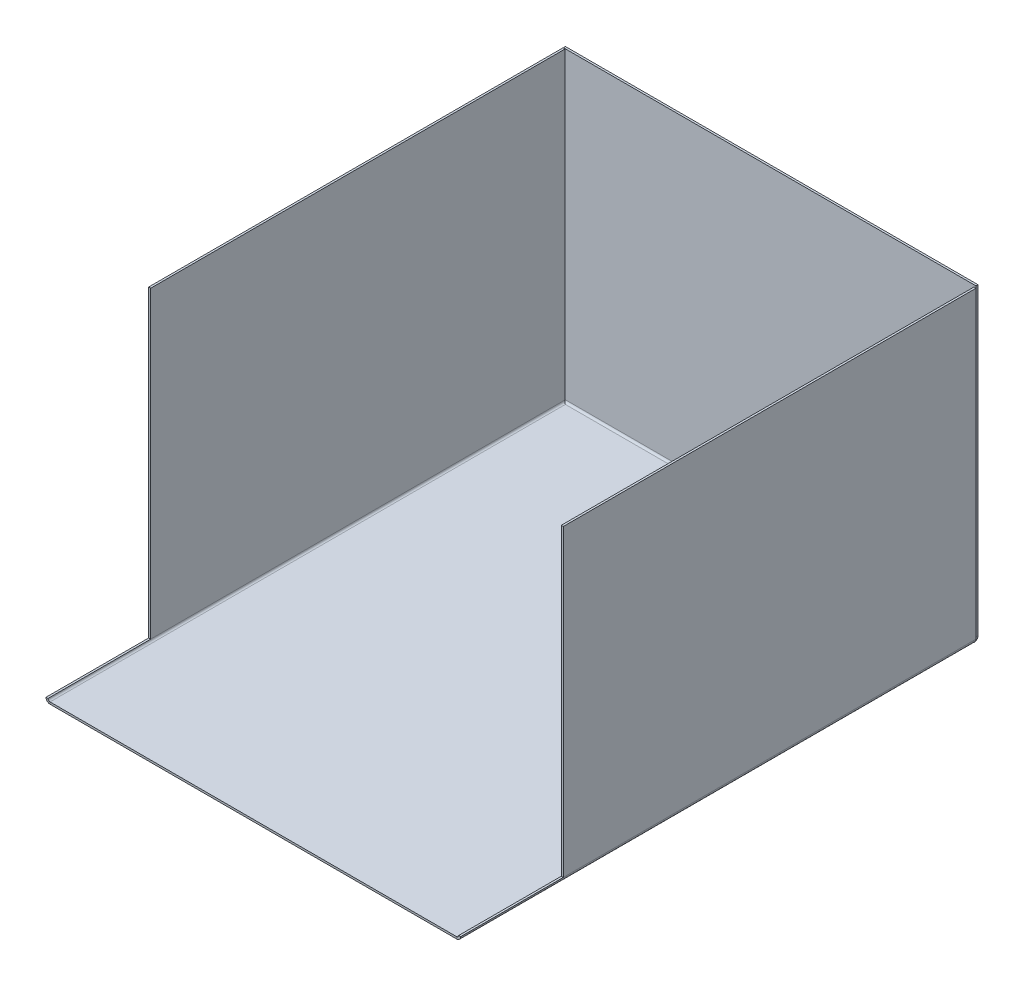
ISO-10303-21;
HEADER;
FILE_DESCRIPTION(('STEP AP214'),'2;1');
FILE_NAME('part.step','',(''),(''),'','','');
FILE_SCHEMA(('AUTOMOTIVE_DESIGN { 1 0 10303 214 1 1 1 1 }'));
ENDSEC;
DATA;
#1=APPLICATION_CONTEXT('core data for automotive mechanical design processes');
#2=APPLICATION_PROTOCOL_DEFINITION('international standard','automotive_design',2000,#1);
#3=PRODUCT_CONTEXT('',#1,'mechanical');
#4=PRODUCT('Part','Part','',(#3));
#5=PRODUCT_RELATED_PRODUCT_CATEGORY('part','',(#4));
#6=PRODUCT_DEFINITION_FORMATION('','',#4);
#7=PRODUCT_DEFINITION_CONTEXT('part definition',#1,'design');
#8=PRODUCT_DEFINITION('design','',#6,#7);
#9=PRODUCT_DEFINITION_SHAPE('','',#8);
#10=(LENGTH_UNIT() NAMED_UNIT(*) SI_UNIT(.MILLI.,.METRE.));
#11=(NAMED_UNIT(*) PLANE_ANGLE_UNIT() SI_UNIT($,.RADIAN.));
#12=(NAMED_UNIT(*) SI_UNIT($,.STERADIAN.) SOLID_ANGLE_UNIT());
#13=UNCERTAINTY_MEASURE_WITH_UNIT(LENGTH_MEASURE(1.E-05),#10,'distance_accuracy_value','');
#14=(GEOMETRIC_REPRESENTATION_CONTEXT(3) GLOBAL_UNCERTAINTY_ASSIGNED_CONTEXT((#13)) GLOBAL_UNIT_ASSIGNED_CONTEXT((#10,
#11,#12)) REPRESENTATION_CONTEXT('',''));
#15=CARTESIAN_POINT('',(0.,0.,0.));
#16=DIRECTION('',(0.,0.,1.));
#17=DIRECTION('',(1.,0.,0.));
#18=AXIS2_PLACEMENT_3D('',#15,#16,#17);
#19=CARTESIAN_POINT('',(-102.6,0.999999999999906,-0.950000000000006));
#20=DIRECTION('',(0.,1.,0.));
#21=DIRECTION('',(0.,0.,-1.));
#22=AXIS2_PLACEMENT_3D('',#19,#20,#21);
#23=PLANE('',#22);
#24=DIRECTION('',(0.,0.,-1.));
#25=VECTOR('',#24,1.);
#26=CARTESIAN_POINT('',(-101.6,0.999999999999938,255.41280087654));
#27=LINE('',#26,#25);
#28=CARTESIAN_POINT('',(-101.6,0.999999999999957,127.));
#29=VERTEX_POINT('',#28);
#30=CARTESIAN_POINT('',(-101.6,1.00000000000025,76.2));
#31=VERTEX_POINT('',#30);
#32=EDGE_CURVE('E299',#29,#31,#27,.T.);
#33=ORIENTED_EDGE('',*,*,#32,.T.);
#34=DIRECTION('',(-1.,0.,0.));
#35=VECTOR('',#34,1.);
#36=CARTESIAN_POINT('',(232.4,1.00000000000142,76.2));
#37=LINE('',#36,#35);
#38=CARTESIAN_POINT('',(-102.6,0.999999999999928,76.2));
#39=VERTEX_POINT('',#38);
#40=EDGE_CURVE('E239',#31,#39,#37,.T.);
#41=ORIENTED_EDGE('',*,*,#40,.T.);
#42=DIRECTION('',(0.,0.,-1.));
#43=VECTOR('',#42,1.);
#44=CARTESIAN_POINT('',(-102.6,0.999999999999943,127.));
#45=LINE('',#44,#43);
#46=CARTESIAN_POINT('',(-102.6,0.999999999999943,127.));
#47=VERTEX_POINT('',#46);
#48=EDGE_CURVE('E259',#47,#39,#45,.T.);
#49=ORIENTED_EDGE('',*,*,#48,.F.);
#50=DIRECTION('',(-1.,0.,0.));
#51=VECTOR('',#50,1.);
#52=CARTESIAN_POINT('',(-102.6,0.999999999999943,127.));
#53=LINE('',#52,#51);
#54=EDGE_CURVE('E254',#29,#47,#53,.T.);
#55=ORIENTED_EDGE('',*,*,#54,.F.);
#56=EDGE_LOOP('',(#33,#41,#49,#55));
#57=FACE_BOUND('',#56,.T.);
#58=ADVANCED_FACE('F78',(#57),#23,.T.);
#59=CARTESIAN_POINT('',(102.6,-3.88578058618805E-13,0.));
#60=DIRECTION('',(-1.,0.,0.));
#61=DIRECTION('',(0.,-1.,0.));
#62=AXIS2_PLACEMENT_3D('',#59,#60,#61);
#63=PLANE('',#62);
#64=DIRECTION('',(0.,1.,0.));
#65=VECTOR('',#64,1.);
#66=CARTESIAN_POINT('',(102.6,-3.88578058618805E-13,76.2));
#67=LINE('',#66,#65);
#68=CARTESIAN_POINT('',(102.6,1.00000000000067,76.2));
#69=VERTEX_POINT('',#68);
#70=CARTESIAN_POINT('',(102.600000000001,151.4,76.2));
#71=VERTEX_POINT('',#70);
#72=EDGE_CURVE('E379',#69,#71,#67,.T.);
#73=ORIENTED_EDGE('',*,*,#72,.F.);
#74=DIRECTION('',(0.,0.,1.));
#75=VECTOR('',#74,1.);
#76=CARTESIAN_POINT('',(102.6,0.999999999999973,0.));
#77=LINE('',#76,#75);
#78=CARTESIAN_POINT('',(102.6,0.999999999999973,-128.));
#79=VERTEX_POINT('',#78);
#80=EDGE_CURVE('E392',#79,#69,#77,.T.);
#81=ORIENTED_EDGE('',*,*,#80,.F.);
#82=DIRECTION('',(0.,1.,0.));
#83=VECTOR('',#82,1.);
#84=CARTESIAN_POINT('',(102.600000000001,151.4,-128.));
#85=LINE('',#84,#83);
#86=CARTESIAN_POINT('',(102.600000000001,151.4,-128.));
#87=VERTEX_POINT('',#86);
#88=EDGE_CURVE('E397',#79,#87,#85,.T.);
#89=ORIENTED_EDGE('',*,*,#88,.T.);
#90=DIRECTION('',(0.,0.,1.));
#91=VECTOR('',#90,1.);
#92=CARTESIAN_POINT('',(102.600000000001,151.4,127.));
#93=LINE('',#92,#91);
#94=EDGE_CURVE('E399',#87,#71,#93,.T.);
#95=ORIENTED_EDGE('',*,*,#94,.T.);
#96=EDGE_LOOP('',(#73,#81,#89,#95));
#97=FACE_BOUND('',#96,.T.);
#98=ADVANCED_FACE('F584',(#97),#63,.F.);
#99=CARTESIAN_POINT('',(101.6,-3.88578058618805E-13,0.));
#100=DIRECTION('',(-1.,0.,0.));
#101=DIRECTION('',(0.,-1.,0.));
#102=AXIS2_PLACEMENT_3D('',#99,#100,#101);
#103=PLANE('',#102);
#104=DIRECTION('',(0.,0.,-1.));
#105=VECTOR('',#104,1.);
#106=CARTESIAN_POINT('',(101.6,0.999999999999973,127.));
#107=LINE('',#106,#105);
#108=CARTESIAN_POINT('',(101.6,1.00000000000067,76.2));
#109=VERTEX_POINT('',#108);
#110=CARTESIAN_POINT('',(101.6,0.999999999999973,-128.));
#111=VERTEX_POINT('',#110);
#112=EDGE_CURVE('E389',#109,#111,#107,.T.);
#113=ORIENTED_EDGE('',*,*,#112,.F.);
#114=DIRECTION('',(0.,1.,0.));
#115=VECTOR('',#114,1.);
#116=CARTESIAN_POINT('',(101.6,-3.88578058618805E-13,76.2));
#117=LINE('',#116,#115);
#118=CARTESIAN_POINT('',(101.600000000001,151.400000000001,76.2));
#119=VERTEX_POINT('',#118);
#120=EDGE_CURVE('E376',#109,#119,#117,.T.);
#121=ORIENTED_EDGE('',*,*,#120,.T.);
#122=DIRECTION('',(0.,0.,1.));
#123=VECTOR('',#122,1.);
#124=CARTESIAN_POINT('',(101.600000000001,151.4,127.));
#125=LINE('',#124,#123);
#126=CARTESIAN_POINT('',(101.600000000001,151.4,-128.));
#127=VERTEX_POINT('',#126);
#128=EDGE_CURVE('E400',#127,#119,#125,.T.);
#129=ORIENTED_EDGE('',*,*,#128,.F.);
#130=DIRECTION('',(0.,1.,0.));
#131=VECTOR('',#130,1.);
#132=CARTESIAN_POINT('',(101.600000000001,151.4,-128.));
#133=LINE('',#132,#131);
#134=EDGE_CURVE('E396',#111,#127,#133,.T.);
#135=ORIENTED_EDGE('',*,*,#134,.F.);
#136=EDGE_LOOP('',(#113,#121,#129,#135));
#137=FACE_BOUND('',#136,.T.);
#138=ADVANCED_FACE('F587',(#137),#103,.T.);
#139=CARTESIAN_POINT('',(102.600000000001,151.4,127.));
#140=DIRECTION('',(0.,-1.,0.));
#141=DIRECTION('',(1.,0.,0.));
#142=AXIS2_PLACEMENT_3D('',#139,#140,#141);
#143=PLANE('',#142);
#144=DIRECTION('',(-1.,0.,0.));
#145=VECTOR('',#144,1.);
#146=CARTESIAN_POINT('',(102.600000000001,151.4,76.2));
#147=LINE('',#146,#145);
#148=EDGE_CURVE('E426',#71,#119,#147,.T.);
#149=ORIENTED_EDGE('',*,*,#148,.F.);
#150=ORIENTED_EDGE('',*,*,#94,.F.);
#151=DIRECTION('',(-1.,0.,0.));
#152=VECTOR('',#151,1.);
#153=CARTESIAN_POINT('',(102.600000000001,151.4,-128.));
#154=LINE('',#153,#152);
#155=EDGE_CURVE('E403',#87,#127,#154,.T.);
#156=ORIENTED_EDGE('',*,*,#155,.T.);
#157=ORIENTED_EDGE('',*,*,#128,.T.);
#158=EDGE_LOOP('',(#149,#150,#156,#157));
#159=FACE_BOUND('',#158,.T.);
#160=ADVANCED_FACE('F591',(#159),#143,.F.);
#161=CARTESIAN_POINT('',(0.,-1.00000000000003,0.));
#162=DIRECTION('',(0.,-1.,0.));
#163=DIRECTION('',(0.,0.,-1.));
#164=AXIS2_PLACEMENT_3D('',#161,#162,#163);
#165=PLANE('',#164);
#166=DIRECTION('',(1.,0.,0.));
#167=VECTOR('',#166,1.);
#168=CARTESIAN_POINT('',(-101.6,-1.00000000000003,-128.));
#169=LINE('',#168,#167);
#170=CARTESIAN_POINT('',(-100.6,-1.00000000000003,-128.));
#171=VERTEX_POINT('',#170);
#172=CARTESIAN_POINT('',(100.6,-0.999999999999985,-128.));
#173=VERTEX_POINT('',#172);
#174=EDGE_CURVE('E430',#171,#173,#169,.T.);
#175=ORIENTED_EDGE('',*,*,#174,.T.);
#176=DIRECTION('',(0.,0.,-1.));
#177=VECTOR('',#176,1.);
#178=CARTESIAN_POINT('',(100.6,-1.,-128.));
#179=LINE('',#178,#177);
#180=CARTESIAN_POINT('',(100.6,-1.00000000000003,127.));
#181=VERTEX_POINT('',#180);
#182=EDGE_CURVE('E414',#173,#181,#179,.F.);
#183=ORIENTED_EDGE('',*,*,#182,.T.);
#184=DIRECTION('',(1.,0.,0.));
#185=VECTOR('',#184,1.);
#186=CARTESIAN_POINT('',(-101.6,-1.00000000000003,127.));
#187=LINE('',#186,#185);
#188=CARTESIAN_POINT('',(-100.6,-1.00000000000003,127.));
#189=VERTEX_POINT('',#188);
#190=EDGE_CURVE('E423',#189,#181,#187,.T.);
#191=ORIENTED_EDGE('',*,*,#190,.F.);
#192=DIRECTION('',(0.,0.,-1.));
#193=VECTOR('',#192,1.);
#194=CARTESIAN_POINT('',(-100.6,-1.00000000000003,127.));
#195=LINE('',#194,#193);
#196=EDGE_CURVE('E467',#189,#171,#195,.T.);
#197=ORIENTED_EDGE('',*,*,#196,.T.);
#198=EDGE_LOOP('',(#175,#183,#191,#197));
#199=FACE_BOUND('',#198,.T.);
#200=ADVANCED_FACE('F595',(#199),#165,.T.);
#201=CARTESIAN_POINT('',(0.,0.,0.));
#202=DIRECTION('',(0.,-1.,0.));
#203=DIRECTION('',(0.,0.,-1.));
#204=AXIS2_PLACEMENT_3D('',#201,#202,#203);
#205=PLANE('',#204);
#206=DIRECTION('',(0.,0.,-1.));
#207=VECTOR('',#206,1.);
#208=CARTESIAN_POINT('',(100.6,0.,-128.));
#209=LINE('',#208,#207);
#210=CARTESIAN_POINT('',(100.6,0.,-128.));
#211=VERTEX_POINT('',#210);
#212=CARTESIAN_POINT('',(100.6,0.,127.));
#213=VERTEX_POINT('',#212);
#214=EDGE_CURVE('E419',#211,#213,#209,.F.);
#215=ORIENTED_EDGE('',*,*,#214,.F.);
#216=DIRECTION('',(1.,0.,0.));
#217=VECTOR('',#216,1.);
#218=CARTESIAN_POINT('',(-101.6,0.,-128.));
#219=LINE('',#218,#217);
#220=CARTESIAN_POINT('',(-100.6,0.,-128.));
#221=VERTEX_POINT('',#220);
#222=EDGE_CURVE('E102',#221,#211,#219,.T.);
#223=ORIENTED_EDGE('',*,*,#222,.F.);
#224=DIRECTION('',(0.,0.,-1.));
#225=VECTOR('',#224,1.);
#226=CARTESIAN_POINT('',(-100.6,0.,127.));
#227=LINE('',#226,#225);
#228=CARTESIAN_POINT('',(-100.6,0.,127.));
#229=VERTEX_POINT('',#228);
#230=EDGE_CURVE('E87',#229,#221,#227,.T.);
#231=ORIENTED_EDGE('',*,*,#230,.F.);
#232=DIRECTION('',(1.,0.,0.));
#233=VECTOR('',#232,1.);
#234=CARTESIAN_POINT('',(-101.6,0.,127.));
#235=LINE('',#234,#233);
#236=EDGE_CURVE('E422',#229,#213,#235,.T.);
#237=ORIENTED_EDGE('',*,*,#236,.T.);
#238=EDGE_LOOP('',(#215,#223,#231,#237));
#239=FACE_BOUND('',#238,.T.);
#240=ADVANCED_FACE('F620',(#239),#205,.F.);
#241=CARTESIAN_POINT('',(-101.6,-1.00000000000003,127.));
#242=DIRECTION('',(0.,0.,1.));
#243=DIRECTION('',(1.,0.,0.));
#244=AXIS2_PLACEMENT_3D('',#241,#242,#243);
#245=PLANE('',#244);
#246=DIRECTION('',(0.,-1.,0.));
#247=VECTOR('',#246,1.);
#248=CARTESIAN_POINT('',(100.6,0.,127.));
#249=LINE('',#248,#247);
#250=EDGE_CURVE('E413',#213,#181,#249,.T.);
#251=ORIENTED_EDGE('',*,*,#250,.F.);
#252=ORIENTED_EDGE('',*,*,#236,.F.);
#253=DIRECTION('',(0.,-1.,0.));
#254=VECTOR('',#253,1.);
#255=CARTESIAN_POINT('',(-100.6,0.,127.));
#256=LINE('',#255,#254);
#257=EDGE_CURVE('E472',#229,#189,#256,.T.);
#258=ORIENTED_EDGE('',*,*,#257,.T.);
#259=ORIENTED_EDGE('',*,*,#190,.T.);
#260=EDGE_LOOP('',(#251,#252,#258,#259));
#261=FACE_BOUND('',#260,.T.);
#262=ADVANCED_FACE('F616',(#261),#245,.T.);
#263=CARTESIAN_POINT('',(100.6,0.999999999999973,-128.));
#264=DIRECTION('',(0.,0.,1.));
#265=DIRECTION('',(1.,0.,0.));
#266=AXIS2_PLACEMENT_3D('',#263,#264,#265);
#267=PLANE('',#266);
#268=DIRECTION('',(0.,-1.,0.));
#269=VECTOR('',#268,1.);
#270=CARTESIAN_POINT('',(101.6,0.,-128.));
#271=LINE('',#270,#269);
#272=CARTESIAN_POINT('',(101.6,0.,-128.));
#273=VERTEX_POINT('',#272);
#274=CARTESIAN_POINT('',(101.6,-0.732050807568885,-128.));
#275=VERTEX_POINT('',#274);
#276=EDGE_CURVE('E457',#273,#275,#271,.T.);
#277=ORIENTED_EDGE('',*,*,#276,.F.);
#278=DIRECTION('',(-1.,0.,0.));
#279=VECTOR('',#278,1.);
#280=CARTESIAN_POINT('',(101.6,0.,-128.));
#281=LINE('',#280,#279);
#282=EDGE_CURVE('E452',#273,#211,#281,.T.);
#283=ORIENTED_EDGE('',*,*,#282,.T.);
#284=CARTESIAN_POINT('',(100.6,0.999999999999973,-128.));
#285=DIRECTION('',(0.,0.,-1.));
#286=DIRECTION('',(-1.,0.,0.));
#287=AXIS2_PLACEMENT_3D('',#284,#285,#286);
#288=CIRCLE('',#287,0.999999999999987);
#289=EDGE_CURVE('E409',#111,#211,#288,.T.);
#290=ORIENTED_EDGE('',*,*,#289,.F.);
#291=DIRECTION('',(1.,0.,0.));
#292=VECTOR('',#291,1.);
#293=CARTESIAN_POINT('',(101.6,0.999999999999973,-128.));
#294=LINE('',#293,#292);
#295=EDGE_CURVE('E388',#111,#79,#294,.T.);
#296=ORIENTED_EDGE('',*,*,#295,.T.);
#297=CARTESIAN_POINT('',(100.6,0.999999999999973,-128.));
#298=DIRECTION('',(0.,0.,-1.));
#299=DIRECTION('',(-1.,0.,0.));
#300=AXIS2_PLACEMENT_3D('',#297,#298,#299);
#301=CIRCLE('',#300,1.99999999999999);
#302=EDGE_CURVE('E418',#79,#275,#301,.T.);
#303=ORIENTED_EDGE('',*,*,#302,.T.);
#304=EDGE_LOOP('',(#277,#283,#290,#296,#303));
#305=FACE_BOUND('',#304,.T.);
#306=ADVANCED_FACE('F612',(#305),#267,.F.);
#307=CARTESIAN_POINT('',(100.6,0.999999999999973,127.));
#308=DIRECTION('',(0.,0.,1.));
#309=DIRECTION('',(1.,0.,0.));
#310=AXIS2_PLACEMENT_3D('',#307,#308,#309);
#311=PLANE('',#310);
#312=DIRECTION('',(1.,0.,0.));
#313=VECTOR('',#312,1.);
#314=CARTESIAN_POINT('',(101.6,0.999999999999973,127.));
#315=LINE('',#314,#313);
#316=CARTESIAN_POINT('',(101.6,1.00000000000067,127.));
#317=VERTEX_POINT('',#316);
#318=CARTESIAN_POINT('',(102.6,1.00000000000067,127.));
#319=VERTEX_POINT('',#318);
#320=EDGE_CURVE('E384',#317,#319,#315,.T.);
#321=ORIENTED_EDGE('',*,*,#320,.F.);
#322=CARTESIAN_POINT('',(100.6,0.999999999999973,127.));
#323=DIRECTION('',(0.,0.,-1.));
#324=DIRECTION('',(-1.,0.,0.));
#325=AXIS2_PLACEMENT_3D('',#322,#323,#324);
#326=CIRCLE('',#325,0.999999999999987);
#327=EDGE_CURVE('E415',#213,#317,#326,.F.);
#328=ORIENTED_EDGE('',*,*,#327,.F.);
#329=ORIENTED_EDGE('',*,*,#250,.T.);
#330=CARTESIAN_POINT('',(100.6,0.999999999999973,127.));
#331=DIRECTION('',(0.,0.,-1.));
#332=DIRECTION('',(-1.,0.,0.));
#333=AXIS2_PLACEMENT_3D('',#330,#331,#332);
#334=CIRCLE('',#333,1.99999999999999);
#335=EDGE_CURVE('E410',#181,#319,#334,.F.);
#336=ORIENTED_EDGE('',*,*,#335,.T.);
#337=EDGE_LOOP('',(#321,#328,#329,#336));
#338=FACE_BOUND('',#337,.T.);
#339=ADVANCED_FACE('F605',(#338),#311,.T.);
#340=CARTESIAN_POINT('',(100.6,0.999999999999973,-128.));
#341=DIRECTION('',(0.,0.,-1.));
#342=DIRECTION('',(1.,0.,0.));
#343=AXIS2_PLACEMENT_3D('',#340,#341,#342);
#344=CYLINDRICAL_SURFACE('',#343,1.99999999999999);
#345=ORIENTED_EDGE('',*,*,#182,.F.);
#346=CARTESIAN_POINT('',(100.6,0.999999999999973,-128.));
#347=DIRECTION('',(0.,0.,-1.));
#348=DIRECTION('',(-1.,0.,0.));
#349=AXIS2_PLACEMENT_3D('',#346,#347,#348);
#350=CIRCLE('',#349,1.99999999999999);
#351=EDGE_CURVE('E462',#275,#173,#350,.T.);
#352=ORIENTED_EDGE('',*,*,#351,.F.);
#353=ORIENTED_EDGE('',*,*,#302,.F.);
#354=ORIENTED_EDGE('',*,*,#80,.T.);
#355=DIRECTION('',(0.,0.,-1.));
#356=VECTOR('',#355,1.);
#357=CARTESIAN_POINT('',(102.6,1.00000000000067,0.));
#358=LINE('',#357,#356);
#359=EDGE_CURVE('E382',#319,#69,#358,.T.);
#360=ORIENTED_EDGE('',*,*,#359,.F.);
#361=ORIENTED_EDGE('',*,*,#335,.F.);
#362=EDGE_LOOP('',(#345,#352,#353,#354,#360,#361));
#363=FACE_BOUND('',#362,.T.);
#364=ADVANCED_FACE('F602',(#363),#344,.T.);
#365=CARTESIAN_POINT('',(100.6,0.999999999999973,-128.));
#366=DIRECTION('',(0.,0.,-1.));
#367=DIRECTION('',(1.,0.,0.));
#368=AXIS2_PLACEMENT_3D('',#365,#366,#367);
#369=CYLINDRICAL_SURFACE('',#368,0.999999999999987);
#370=ORIENTED_EDGE('',*,*,#214,.T.);
#371=ORIENTED_EDGE('',*,*,#327,.T.);
#372=EDGE_CURVE('E385',#317,#109,#107,.T.);
#373=ORIENTED_EDGE('',*,*,#372,.T.);
#374=ORIENTED_EDGE('',*,*,#112,.T.);
#375=ORIENTED_EDGE('',*,*,#289,.T.);
#376=EDGE_LOOP('',(#370,#371,#373,#374,#375));
#377=FACE_BOUND('',#376,.T.);
#378=ADVANCED_FACE('F600',(#377),#369,.F.);
#379=CARTESIAN_POINT('',(102.600000000001,151.4,-128.));
#380=DIRECTION('',(0.,0.,1.));
#381=DIRECTION('',(1.,0.,0.));
#382=AXIS2_PLACEMENT_3D('',#379,#380,#381);
#383=PLANE('',#382);
#384=ORIENTED_EDGE('',*,*,#295,.F.);
#385=ORIENTED_EDGE('',*,*,#134,.T.);
#386=ORIENTED_EDGE('',*,*,#155,.F.);
#387=ORIENTED_EDGE('',*,*,#88,.F.);
#388=EDGE_LOOP('',(#384,#385,#386,#387));
#389=FACE_BOUND('',#388,.T.);
#390=ADVANCED_FACE('F597',(#389),#383,.F.);
#391=CARTESIAN_POINT('',(232.4,151.400000000001,76.2));
#392=DIRECTION('',(0.,0.,1.));
#393=DIRECTION('',(0.,-1.,0.));
#394=AXIS2_PLACEMENT_3D('',#391,#392,#393);
#395=PLANE('',#394);
#396=ORIENTED_EDGE('',*,*,#72,.T.);
#397=ORIENTED_EDGE('',*,*,#148,.T.);
#398=ORIENTED_EDGE('',*,*,#120,.F.);
#399=DIRECTION('',(-1.,0.,0.));
#400=VECTOR('',#399,1.);
#401=CARTESIAN_POINT('',(232.4,1.00000000000114,76.2));
#402=LINE('',#401,#400);
#403=EDGE_CURVE('E380',#69,#109,#402,.T.);
#404=ORIENTED_EDGE('',*,*,#403,.F.);
#405=EDGE_LOOP('',(#396,#397,#398,#404));
#406=FACE_BOUND('',#405,.T.);
#407=ADVANCED_FACE('F80',(#406),#395,.T.);
#408=CARTESIAN_POINT('',(232.4,1.00000000000111,127.));
#409=DIRECTION('',(0.,1.,0.));
#410=DIRECTION('',(-1.,0.,0.));
#411=AXIS2_PLACEMENT_3D('',#408,#409,#410);
#412=PLANE('',#411);
#413=ORIENTED_EDGE('',*,*,#359,.T.);
#414=ORIENTED_EDGE('',*,*,#403,.T.);
#415=ORIENTED_EDGE('',*,*,#372,.F.);
#416=ORIENTED_EDGE('',*,*,#320,.T.);
#417=EDGE_LOOP('',(#413,#414,#415,#416));
#418=FACE_BOUND('',#417,.T.);
#419=ADVANCED_FACE('F626',(#418),#412,.T.);
#420=CARTESIAN_POINT('',(101.6,151.4,-130.000000000001));
#421=DIRECTION('',(0.,-1.,0.));
#422=DIRECTION('',(0.,0.,-1.));
#423=AXIS2_PLACEMENT_3D('',#420,#421,#422);
#424=PLANE('',#423);
#425=DIRECTION('',(-1.,0.,0.));
#426=VECTOR('',#425,1.);
#427=CARTESIAN_POINT('',(101.6,151.4,-129.000000000001));
#428=LINE('',#427,#426);
#429=CARTESIAN_POINT('',(-102.600000000001,151.4,-129.000000000001));
#430=VERTEX_POINT('',#429);
#431=CARTESIAN_POINT('',(101.6,151.4,-129.000000000001));
#432=VERTEX_POINT('',#431);
#433=EDGE_CURVE('E546',#430,#432,#428,.F.);
#434=ORIENTED_EDGE('',*,*,#433,.T.);
#435=DIRECTION('',(0.,0.,1.));
#436=VECTOR('',#435,1.);
#437=CARTESIAN_POINT('',(101.6,151.4,-130.000000000001));
#438=LINE('',#437,#436);
#439=CARTESIAN_POINT('',(101.6,151.4,-130.000000000001));
#440=VERTEX_POINT('',#439);
#441=EDGE_CURVE('E529',#440,#432,#438,.T.);
#442=ORIENTED_EDGE('',*,*,#441,.F.);
#443=DIRECTION('',(1.,0.,0.));
#444=VECTOR('',#443,1.);
#445=CARTESIAN_POINT('',(0.,151.4,-130.000000000001));
#446=LINE('',#445,#444);
#447=CARTESIAN_POINT('',(-102.600000000001,151.4,-130.000000000001));
#448=VERTEX_POINT('',#447);
#449=EDGE_CURVE('E540',#448,#440,#446,.T.);
#450=ORIENTED_EDGE('',*,*,#449,.F.);
#451=DIRECTION('',(0.,0.,1.));
#452=VECTOR('',#451,1.);
#453=CARTESIAN_POINT('',(-102.600000000001,151.4,-130.000000000001));
#454=LINE('',#453,#452);
#455=EDGE_CURVE('E543',#448,#430,#454,.T.);
#456=ORIENTED_EDGE('',*,*,#455,.T.);
#457=EDGE_LOOP('',(#434,#442,#450,#456));
#458=FACE_BOUND('',#457,.T.);
#459=ADVANCED_FACE('F505',(#458),#424,.F.);
#460=CARTESIAN_POINT('',(0.,-4.45857425595861E-13,-130.));
#461=DIRECTION('',(0.,0.,1.));
#462=DIRECTION('',(0.,-1.,0.));
#463=AXIS2_PLACEMENT_3D('',#460,#461,#462);
#464=PLANE('',#463);
#465=DIRECTION('',(1.,0.,0.));
#466=VECTOR('',#465,1.);
#467=CARTESIAN_POINT('',(101.6,1.00000000000001,-130.));
#468=LINE('',#467,#466);
#469=CARTESIAN_POINT('',(-102.6,0.999999999999987,-130.));
#470=VERTEX_POINT('',#469);
#471=CARTESIAN_POINT('',(101.6,0.999999999999987,-130.));
#472=VERTEX_POINT('',#471);
#473=EDGE_CURVE('E373',#470,#472,#468,.T.);
#474=ORIENTED_EDGE('',*,*,#473,.F.);
#475=DIRECTION('',(0.,1.,0.));
#476=VECTOR('',#475,1.);
#477=CARTESIAN_POINT('',(-102.6,0.999999999999987,-130.));
#478=LINE('',#477,#476);
#479=EDGE_CURVE('E542',#470,#448,#478,.T.);
#480=ORIENTED_EDGE('',*,*,#479,.T.);
#481=ORIENTED_EDGE('',*,*,#449,.T.);
#482=DIRECTION('',(0.,-1.,0.));
#483=VECTOR('',#482,1.);
#484=CARTESIAN_POINT('',(101.6,-4.45857425595861E-13,-130.));
#485=LINE('',#484,#483);
#486=EDGE_CURVE('E536',#440,#472,#485,.T.);
#487=ORIENTED_EDGE('',*,*,#486,.T.);
#488=EDGE_LOOP('',(#474,#480,#481,#487));
#489=FACE_BOUND('',#488,.T.);
#490=ADVANCED_FACE('F576',(#489),#464,.F.);
#491=CARTESIAN_POINT('',(-102.6,0.999999999999987,-130.));
#492=DIRECTION('',(1.,0.,0.));
#493=DIRECTION('',(0.,1.,0.));
#494=AXIS2_PLACEMENT_3D('',#491,#492,#493);
#495=PLANE('',#494);
#496=DIRECTION('',(0.,1.,0.));
#497=VECTOR('',#496,1.);
#498=CARTESIAN_POINT('',(-102.6,0.99999999999999,-129.));
#499=LINE('',#498,#497);
#500=CARTESIAN_POINT('',(-102.6,0.99999999999999,-129.));
#501=VERTEX_POINT('',#500);
#502=EDGE_CURVE('E539',#501,#430,#499,.T.);
#503=ORIENTED_EDGE('',*,*,#502,.T.);
#504=ORIENTED_EDGE('',*,*,#455,.F.);
#505=ORIENTED_EDGE('',*,*,#479,.F.);
#506=CARTESIAN_POINT('',(-102.6,1.,-128.99));
#507=CARTESIAN_POINT('',(-102.6,1.,-129.));
#508=CARTESIAN_POINT('',(-102.6,0.999999999999987,-130.));
#509=CARTESIAN_POINT('',(-102.6,0.999999999999987,-130.0101));
#510=B_SPLINE_CURVE_WITH_KNOTS('',1,(#506,#507,#508,#509),.UNSPECIFIED.,.F.,.F.,(2,1,1,2),
(-0.0101,-9.9999999999989E-05,0.9999,1.01),.UNSPECIFIED.);
#511=EDGE_CURVE('E535',#470,#501,#510,.F.);
#512=ORIENTED_EDGE('',*,*,#511,.T.);
#513=EDGE_LOOP('',(#503,#504,#505,#512));
#514=FACE_BOUND('',#513,.T.);
#515=ADVANCED_FACE('F566',(#514),#495,.F.);
#516=CARTESIAN_POINT('',(0.,-4.42365944257018E-13,-129.));
#517=DIRECTION('',(0.,0.,1.));
#518=DIRECTION('',(0.,-1.,0.));
#519=AXIS2_PLACEMENT_3D('',#516,#517,#518);
#520=PLANE('',#519);
#521=ORIENTED_EDGE('',*,*,#433,.F.);
#522=ORIENTED_EDGE('',*,*,#502,.F.);
#523=DIRECTION('',(-1.,0.,0.));
#524=VECTOR('',#523,1.);
#525=CARTESIAN_POINT('',(101.6,1.,-129.));
#526=LINE('',#525,#524);
#527=CARTESIAN_POINT('',(101.6,1.,-129.));
#528=VERTEX_POINT('',#527);
#529=EDGE_CURVE('E548',#528,#501,#526,.T.);
#530=ORIENTED_EDGE('',*,*,#529,.F.);
#531=DIRECTION('',(0.,1.,0.));
#532=VECTOR('',#531,1.);
#533=CARTESIAN_POINT('',(101.6,0.,-129.));
#534=LINE('',#533,#532);
#535=EDGE_CURVE('E447',#432,#528,#534,.F.);
#536=ORIENTED_EDGE('',*,*,#535,.F.);
#537=EDGE_LOOP('',(#521,#522,#530,#536));
#538=FACE_BOUND('',#537,.T.);
#539=ADVANCED_FACE('F575',(#538),#520,.T.);
#540=CARTESIAN_POINT('',(101.6,0.,-130.));
#541=DIRECTION('',(-1.,0.,0.));
#542=DIRECTION('',(0.,0.,1.));
#543=AXIS2_PLACEMENT_3D('',#540,#541,#542);
#544=PLANE('',#543);
#545=DIRECTION('',(0.,0.,-1.));
#546=VECTOR('',#545,1.);
#547=CARTESIAN_POINT('',(101.6,1.00000000000001,-130.));
#548=LINE('',#547,#546);
#549=EDGE_CURVE('E532',#528,#472,#548,.T.);
#550=ORIENTED_EDGE('',*,*,#549,.T.);
#551=ORIENTED_EDGE('',*,*,#486,.F.);
#552=ORIENTED_EDGE('',*,*,#441,.T.);
#553=ORIENTED_EDGE('',*,*,#535,.T.);
#554=EDGE_LOOP('',(#550,#551,#552,#553));
#555=FACE_BOUND('',#554,.T.);
#556=ADVANCED_FACE('F579',(#555),#544,.F.);
#557=CARTESIAN_POINT('',(101.6,1.00000000000001,-128.));
#558=DIRECTION('',(1.,0.,0.));
#559=DIRECTION('',(0.,0.,-1.));
#560=AXIS2_PLACEMENT_3D('',#557,#558,#559);
#561=PLANE('',#560);
#562=ORIENTED_EDGE('',*,*,#549,.F.);
#563=CARTESIAN_POINT('',(101.6,1.00000000000001,-128.));
#564=DIRECTION('',(-1.,0.,0.));
#565=DIRECTION('',(0.,0.,1.));
#566=AXIS2_PLACEMENT_3D('',#563,#564,#565);
#567=CIRCLE('',#566,1.);
#568=EDGE_CURVE('E353',#528,#273,#567,.T.);
#569=ORIENTED_EDGE('',*,*,#568,.T.);
#570=ORIENTED_EDGE('',*,*,#276,.T.);
#571=DIRECTION('',(0.,-1.,0.));
#572=VECTOR('',#571,1.);
#573=CARTESIAN_POINT('',(101.6,-0.999999999999986,-128.));
#574=LINE('',#573,#572);
#575=CARTESIAN_POINT('',(101.6,-0.999999999999986,-128.));
#576=VERTEX_POINT('',#575);
#577=EDGE_CURVE('E370',#275,#576,#574,.T.);
#578=ORIENTED_EDGE('',*,*,#577,.T.);
#579=CARTESIAN_POINT('',(101.6,1.00000000000001,-128.));
#580=DIRECTION('',(-1.,0.,0.));
#581=DIRECTION('',(0.,0.,1.));
#582=AXIS2_PLACEMENT_3D('',#579,#580,#581);
#583=CIRCLE('',#582,2.);
#584=EDGE_CURVE('E354',#472,#576,#583,.T.);
#585=ORIENTED_EDGE('',*,*,#584,.F.);
#586=EDGE_LOOP('',(#562,#569,#570,#578,#585));
#587=FACE_BOUND('',#586,.T.);
#588=ADVANCED_FACE('F504',(#587),#561,.T.);
#589=CARTESIAN_POINT('',(0.500000000000056,-0.999999999999985,-128.));
#590=DIRECTION('',(0.,0.,1.));
#591=DIRECTION('',(-1.,0.,0.));
#592=AXIS2_PLACEMENT_3D('',#589,#590,#591);
#593=PLANE('',#592);
#594=ORIENTED_EDGE('',*,*,#577,.F.);
#595=ORIENTED_EDGE('',*,*,#351,.T.);
#596=DIRECTION('',(-1.,0.,0.));
#597=VECTOR('',#596,1.);
#598=CARTESIAN_POINT('',(-100.6,-0.999999999999985,-128.));
#599=LINE('',#598,#597);
#600=EDGE_CURVE('E357',#576,#173,#599,.T.);
#601=ORIENTED_EDGE('',*,*,#600,.F.);
#602=EDGE_LOOP('',(#594,#595,#601));
#603=FACE_BOUND('',#602,.T.);
#604=ADVANCED_FACE('F502',(#603),#593,.T.);
#605=CARTESIAN_POINT('',(-100.6,-1.01009999999998,-128.));
#606=CARTESIAN_POINT('',(-100.766688150092,-1.01009999999999,-128.263155311734));
#607=CARTESIAN_POINT('',(-100.933333333333,-0.95778247737098,-128.526139422351));
#608=CARTESIAN_POINT('',(-101.266666666666,-0.756398019230903,-129.012324512444));
#609=CARTESIAN_POINT('',(-101.433333333333,-0.607410319904594,-129.235300361822));
#610=CARTESIAN_POINT('',(-101.766666666666,-0.235300361821593,-129.607410319905));
#611=CARTESIAN_POINT('',(-101.933333333333,-0.0123245124435623,-129.756398019231));
#612=CARTESIAN_POINT('',(-102.266666666666,0.473860577649394,-129.957782477371));
#613=CARTESIAN_POINT('',(-102.433311849908,0.736844688266329,-130.0101));
#614=CARTESIAN_POINT('',(-102.6,0.999999999999987,-130.0101));
#615=CARTESIAN_POINT('',(-100.6,-0.999999999999985,-128.));
#616=CARTESIAN_POINT('',(-100.76668804991,-0.999999999999992,-128.26183297652));
#617=CARTESIAN_POINT('',(-100.933333333333,-0.94794535333663,-128.523495768719));
#618=CARTESIAN_POINT('',(-101.266666666666,-0.747572776708525,-129.007237960742));
#619=CARTESIAN_POINT('',(-101.433333333333,-0.599333684796372,-129.22909343995));
#620=CARTESIAN_POINT('',(-101.766666666666,-0.229093439949846,-129.599333684796));
#621=CARTESIAN_POINT('',(-101.933333333333,-0.00723796074181604,-129.747572776708));
#622=CARTESIAN_POINT('',(-102.266666666666,0.476504231281423,-129.947945353337));
#623=CARTESIAN_POINT('',(-102.433311950089,0.738167023479919,-130.));
#624=CARTESIAN_POINT('',(-102.6,0.999999999999987,-130.));
#625=CARTESIAN_POINT('',(-100.6,0.,-128.));
#626=CARTESIAN_POINT('',(-100.766678130975,0.,-128.130908697947));
#627=CARTESIAN_POINT('',(-100.933333333333,0.026027323331692,-128.261747884359));
#628=CARTESIAN_POINT('',(-101.266666666666,0.126213611645744,-128.503618980371));
#629=CARTESIAN_POINT('',(-101.433333333333,0.200333157601822,-128.614546719975));
#630=CARTESIAN_POINT('',(-101.766666666666,0.385453280025086,-128.799666842398));
#631=CARTESIAN_POINT('',(-101.933333333333,0.496381019629102,-128.873786388354));
#632=CARTESIAN_POINT('',(-102.266666666666,0.738252115640721,-128.973972676668));
#633=CARTESIAN_POINT('',(-102.433321869024,0.869091302053264,-129.));
#634=CARTESIAN_POINT('',(-102.6,1.,-129.));
#635=CARTESIAN_POINT('',(-100.6,0.0100000000000152,-128.));
#636=CARTESIAN_POINT('',(-100.766678031786,0.0100000000000117,-128.129599455161));
#637=CARTESIAN_POINT('',(-100.933333333333,0.0357670500983753,-128.259130405516));
#638=CARTESIAN_POINT('',(-101.266666666666,0.134951475529287,-128.498582790567));
#639=CARTESIAN_POINT('',(-101.433333333333,0.208329826025804,-128.608401252775));
#640=CARTESIAN_POINT('',(-101.766666666666,0.391598747224835,-128.791670173974));
#641=CARTESIAN_POINT('',(-101.933333333333,0.501417209432811,-128.865048524471));
#642=CARTESIAN_POINT('',(-102.266666666666,0.740869594484314,-128.964232949902));
#643=CARTESIAN_POINT('',(-102.433321968214,0.870400544838997,-128.99));
#644=CARTESIAN_POINT('',(-102.6,1.,-128.99));
#645=B_SPLINE_SURFACE_WITH_KNOTS('',1,3,((#605,#606,#607,#608,#609,#610,#611,#612,#613,#614),
(#615,#616,#617,#618,#619,#620,#621,#622,#623,#624),(#625,#626,#627,#628,#629,#630,#631,#632,
#633,#634),(#635,#636,#637,#638,#639,#640,#641,#642,#643,#644)),.UNSPECIFIED.,.F.,.F.,.F.,(2,1,
1,2),(4,2,2,2,4),(-0.0101,0.,1.,1.01),(0.,0.25,0.5,0.75,1.),.UNSPECIFIED.);
#646=CARTESIAN_POINT('',(-100.6,0.,-128.));
#647=CARTESIAN_POINT('',(-100.658147613793,-2.14077937880508E-05,-128.045667320992));
#648=CARTESIAN_POINT('',(-100.716292902787,0.00312712253656283,-128.091332730018));
#649=CARTESIAN_POINT('',(-100.832575112348,0.0156119080987588,-128.181806383419));
#650=CARTESIAN_POINT('',(-100.890712033066,0.0249474035170183,-128.226614732354));
#651=CARTESIAN_POINT('',(-101.006794494844,0.0496129068006964,-128.314386194895));
#652=CARTESIAN_POINT('',(-101.064740028624,0.0649228524866893,-128.357354955476));
#653=CARTESIAN_POINT('',(-101.18062847435,0.101246302643628,-128.440808206124));
#654=CARTESIAN_POINT('',(-101.238571386312,0.122259587833901,-128.481292791629));
#655=CARTESIAN_POINT('',(-101.354763706344,0.169728876984791,-128.559234312637));
#656=CARTESIAN_POINT('',(-101.41301310444,0.19621325175807,-128.596673988423));
#657=CARTESIAN_POINT('',(-101.529541825847,0.25406641400005,-128.66759136592));
#658=CARTESIAN_POINT('',(-101.587821150528,0.285437457221465,-128.701067225255));
#659=CARTESIAN_POINT('',(-101.704357577531,0.352455362183251,-128.763399923163));
#660=CARTESIAN_POINT('',(-101.762614680491,0.38810072327186,-128.792258374583));
#661=CARTESIAN_POINT('',(-101.879100755957,0.462989526054618,-128.844814130143));
#662=CARTESIAN_POINT('',(-101.937329727996,0.502231163569835,-128.868514002313));
#663=CARTESIAN_POINT('',(-102.045872152208,0.578052447334075,-128.907481525386));
#664=CARTESIAN_POINT('',(-102.096186325959,0.614269539104366,-128.923457300368));
#665=CARTESIAN_POINT('',(-102.196811355324,0.688337630481012,-128.951014155827));
#666=CARTESIAN_POINT('',(-102.247122210863,0.72618849248969,-128.962595605596));
#667=CARTESIAN_POINT('',(-102.347855734208,0.803082877967601,-128.981218829405));
#668=CARTESIAN_POINT('',(-102.398278398024,0.842128901033182,-128.988250295823));
#669=CARTESIAN_POINT('',(-102.499133350498,0.920783179829402,-128.997647315108));
#670=CARTESIAN_POINT('',(-102.549565639354,0.960391528582781,-129.000012086712));
#671=CARTESIAN_POINT('',(-102.6,1.,-129.));
#672=B_SPLINE_CURVE_WITH_KNOTS('',3,(#646,#647,#648,#649,#650,#651,#652,#653,#654,#655,#656,
#657,#658,#659,#660,#661,#662,#663,#664,#665,#666,#667,#668,#669,#670,#671),.UNSPECIFIED.,.F.,
.F.,(4,2,2,2,2,2,2,2,2,2,2,2,4),(0.,0.221739184177113,0.443451141882194,0.664424911053834,
0.885390185480495,1.1075314301972,1.32977552389065,1.55194181806883,1.77399725976608,
1.96588722358548,2.15776105766454,2.35006805869545,2.54240725162684),.UNSPECIFIED.);
#673=EDGE_CURVE('E358',#221,#501,#672,.T.);
#674=CARTESIAN_POINT('',(-100.6,-0.999999999999985,-128.));
#675=CARTESIAN_POINT('',(-100.642467591936,-1.00001103030952,-128.066703906455));
#676=CARTESIAN_POINT('',(-100.684932104477,-0.996663104863029,-128.133404980905));
#677=CARTESIAN_POINT('',(-100.769856588884,-0.983332582351079,-128.266137671832));
#678=CARTESIAN_POINT('',(-100.812316560862,-0.973350429622042,-128.332169332843));
#679=CARTESIAN_POINT('',(-100.897212093393,-0.946843156900428,-128.462866676542));
#680=CARTESIAN_POINT('',(-100.939647652177,-0.930322228569598,-128.527533206423));
#681=CARTESIAN_POINT('',(-101.024509226254,-0.890921736778076,-128.654877279434));
#682=CARTESIAN_POINT('',(-101.066935241694,-0.86804227840079,-128.717554855415));
#683=CARTESIAN_POINT('',(-101.194332019958,-0.79008878635419,-128.901855865292));
#684=CARTESIAN_POINT('',(-101.279365704318,-0.725717545514166,-129.019659982919));
#685=CARTESIAN_POINT('',(-101.44935024992,-0.574888656089092,-129.23998571716));
#686=CARTESIAN_POINT('',(-101.534301131326,-0.488441927782675,-129.342514850393));
#687=CARTESIAN_POINT('',(-101.704204943798,-0.296894533226306,-129.528356236763));
#688=CARTESIAN_POINT('',(-101.78915787473,-0.191792866988491,-129.611667459182));
#689=CARTESIAN_POINT('',(-101.959144965089,0.0329978887241732,-129.755765425432));
#690=CARTESIAN_POINT('',(-102.044179143368,0.152692747007304,-129.816543223001));
#691=CARTESIAN_POINT('',(-102.168376124748,0.334579159106643,-129.887070926173));
#692=CARTESIAN_POINT('',(-102.207610819968,0.393071477473287,-129.906683871271));
#693=CARTESIAN_POINT('',(-102.286085811613,0.511630350046737,-129.940434779625));
#694=CARTESIAN_POINT('',(-102.325326107634,0.571696821122404,-129.95457303138));
#695=CARTESIAN_POINT('',(-102.403802112726,0.692869958256186,-129.977237999668));
#696=CARTESIAN_POINT('',(-102.443037821922,0.75397654709868,-129.985765130908));
#697=CARTESIAN_POINT('',(-102.521514932456,0.876721212612444,-129.9971503662));
#698=CARTESIAN_POINT('',(-102.560756333949,0.938359346418661,-130.000007853007));
#699=CARTESIAN_POINT('',(-102.6,0.999999999999987,-130.));
#700=B_SPLINE_CURVE_WITH_KNOTS('',3,(#674,#675,#676,#677,#678,#679,#680,#681,#682,#683,#684,
#685,#686,#687,#688,#689,#690,#691,#692,#693,#694,#695,#696,#697,#698,#699),.UNSPECIFIED.,.F.,
.F.,(4,2,2,2,2,2,2,2,2,2,2,2,4),(0.,0.237148055462207,0.47428022921027,0.711260635690109,
0.948237125977452,1.42250230585619,1.89653332968242,2.3705897713637,2.84483422277829,
3.06399468036339,3.2831435872967,3.5022762955377,3.72143285912608),.UNSPECIFIED.);
#701=EDGE_CURVE('E363',#171,#470,#700,.T.);
#702=CARTESIAN_POINT('',(-100.6,0.,-128.));
#703=CARTESIAN_POINT('',(-100.6,-1.00000000000003,-128.));
#704=B_SPLINE_CURVE_WITH_KNOTS('',1,(#702,#703),.UNSPECIFIED.,.F.,.F.,(2,2),(0.,1.),.UNSPECIFIED.);
#705=EDGE_CURVE('E13',#221,#171,#704,.T.);
#706=ORIENTED_EDGE('',*,*,#673,.T.);
#707=ORIENTED_EDGE('',*,*,#511,.F.);
#708=ORIENTED_EDGE('',*,*,#701,.F.);
#709=ORIENTED_EDGE('',*,*,#705,.F.);
#710=EDGE_LOOP('',(#706,#707,#708,#709));
#711=FACE_BOUND('',#710,.T.);
#712=ADVANCED_FACE('F494',(#711),#645,.T.);
#713=CARTESIAN_POINT('',(203.716041613962,1.00000000000001,-128.));
#714=DIRECTION('',(-1.,0.,0.));
#715=DIRECTION('',(0.,0.,1.));
#716=AXIS2_PLACEMENT_3D('',#713,#714,#715);
#717=CYLINDRICAL_SURFACE('',#716,2.);
#718=ORIENTED_EDGE('',*,*,#600,.T.);
#719=ORIENTED_EDGE('',*,*,#174,.F.);
#720=ORIENTED_EDGE('',*,*,#701,.T.);
#721=ORIENTED_EDGE('',*,*,#473,.T.);
#722=ORIENTED_EDGE('',*,*,#584,.T.);
#723=EDGE_LOOP('',(#718,#719,#720,#721,#722));
#724=FACE_BOUND('',#723,.T.);
#725=ADVANCED_FACE('F501',(#724),#717,.T.);
#726=CARTESIAN_POINT('',(203.716041613962,1.00000000000001,-128.));
#727=DIRECTION('',(-1.,0.,0.));
#728=DIRECTION('',(0.,0.,1.));
#729=AXIS2_PLACEMENT_3D('',#726,#727,#728);
#730=CYLINDRICAL_SURFACE('',#729,1.);
#731=ORIENTED_EDGE('',*,*,#282,.F.);
#732=ORIENTED_EDGE('',*,*,#568,.F.);
#733=ORIENTED_EDGE('',*,*,#529,.T.);
#734=ORIENTED_EDGE('',*,*,#673,.F.);
#735=ORIENTED_EDGE('',*,*,#222,.T.);
#736=EDGE_LOOP('',(#731,#732,#733,#734,#735));
#737=FACE_BOUND('',#736,.T.);
#738=ADVANCED_FACE('F490',(#737),#730,.F.);
#739=CARTESIAN_POINT('',(-102.6,0.999999999999971,-128.9));
#740=CARTESIAN_POINT('',(-102.6,0.738156990522184,-128.82498750331));
#741=CARTESIAN_POINT('',(-102.547945353337,0.47650423128141,-128.75));
#742=CARTESIAN_POINT('',(-102.347572776709,-0.0072379607418284,-128.6));
#743=CARTESIAN_POINT('',(-102.199333684796,-0.229093439949859,-128.525));
#744=CARTESIAN_POINT('',(-101.82909343995,-0.599333684796389,-128.375));
#745=CARTESIAN_POINT('',(-101.607237960742,-0.747572776708544,-128.3));
#746=CARTESIAN_POINT('',(-101.123495768719,-0.94794535333666,-128.15));
#747=CARTESIAN_POINT('',(-100.861843009478,-1.00000000000003,-128.07501249669));
#748=CARTESIAN_POINT('',(-100.6,-1.00000000000003,-128.));
#749=CARTESIAN_POINT('',(-101.6,0.999999999999971,-128.9));
#750=CARTESIAN_POINT('',(-101.6,0.869082538124464,-128.8249898197));
#751=CARTESIAN_POINT('',(-101.573972676668,0.73825211564069,-128.75));
#752=CARTESIAN_POINT('',(-101.473786388354,0.496381019629071,-128.6));
#753=CARTESIAN_POINT('',(-101.399666842398,0.385453280025057,-128.525));
#754=CARTESIAN_POINT('',(-101.214546719975,0.200333157601792,-128.375));
#755=CARTESIAN_POINT('',(-101.103618980371,0.126213611645714,-128.3));
#756=CARTESIAN_POINT('',(-100.861747884359,0.0260273233316559,-128.15));
#757=CARTESIAN_POINT('',(-100.730917461875,0.,-128.0750101803));
#758=CARTESIAN_POINT('',(-100.6,0.,-128.));
#759=B_SPLINE_SURFACE_WITH_KNOTS('',1,3,((#739,#740,#741,#742,#743,#744,#745,#746,#747,#748),
(#749,#750,#751,#752,#753,#754,#755,#756,#757,#758)),.UNSPECIFIED.,.F.,.F.,.F.,(2,2),(4,2,2,2,
4),(0.,1.),(0.,0.25,0.5,0.75,1.),.UNSPECIFIED.);
#760=CARTESIAN_POINT('',(-102.6,0.999999999999971,-128.9));
#761=CARTESIAN_POINT('',(-101.6,0.999999999999971,-128.9));
#762=B_SPLINE_CURVE_WITH_KNOTS('',1,(#760,#761),.UNSPECIFIED.,.F.,.F.,(2,2),(0.,1.),.UNSPECIFIED.);
#763=CARTESIAN_POINT('',(-101.6,1.00000000000026,-128.9));
#764=VERTEX_POINT('',#763);
#765=CARTESIAN_POINT('',(-102.6,1.00000000000025,-128.9));
#766=VERTEX_POINT('',#765);
#767=EDGE_CURVE('E307',#764,#766,#762,.F.);
#768=CARTESIAN_POINT('',(-101.6,0.999999999999971,-128.9));
#769=CARTESIAN_POINT('',(-101.6,0.869082538124464,-128.8249898197));
#770=CARTESIAN_POINT('',(-101.573972676668,0.73825211564069,-128.75));
#771=CARTESIAN_POINT('',(-101.473786388354,0.496381019629071,-128.6));
#772=CARTESIAN_POINT('',(-101.399666842398,0.385453280025057,-128.525));
#773=CARTESIAN_POINT('',(-101.214546719975,0.200333157601792,-128.375));
#774=CARTESIAN_POINT('',(-101.103618980371,0.126213611645714,-128.3));
#775=CARTESIAN_POINT('',(-100.861747884359,0.0260273233316559,-128.15));
#776=CARTESIAN_POINT('',(-100.730917461875,0.,-128.0750101803));
#777=CARTESIAN_POINT('',(-100.6,0.,-128.));
#778=B_SPLINE_CURVE_WITH_KNOTS('',3,(#768,#769,#770,#771,#772,#773,#774,#775,#776,#777),
.UNSPECIFIED.,.F.,.F.,(4,2,2,2,4),(0.,0.25,0.5,0.75,1.),.UNSPECIFIED.);
#779=EDGE_CURVE('E260',#764,#221,#778,.T.);
#780=CARTESIAN_POINT('',(-100.6,-1.00000000000003,-128.));
#781=CARTESIAN_POINT('',(-100.861843009478,-1.00000000000003,-128.07501249669));
#782=CARTESIAN_POINT('',(-101.123495768719,-0.94794535333666,-128.15));
#783=CARTESIAN_POINT('',(-101.607237960742,-0.747572776708544,-128.3));
#784=CARTESIAN_POINT('',(-101.82909343995,-0.599333684796389,-128.375));
#785=CARTESIAN_POINT('',(-102.199333684796,-0.229093439949859,-128.525));
#786=CARTESIAN_POINT('',(-102.347572776709,-0.0072379607418284,-128.6));
#787=CARTESIAN_POINT('',(-102.547945353337,0.47650423128141,-128.75));
#788=CARTESIAN_POINT('',(-102.6,0.738156990522184,-128.82498750331));
#789=CARTESIAN_POINT('',(-102.6,0.999999999999971,-128.9));
#790=B_SPLINE_CURVE_WITH_KNOTS('',3,(#780,#781,#782,#783,#784,#785,#786,#787,#788,#789),
.UNSPECIFIED.,.F.,.F.,(4,2,2,2,4),(0.,0.25,0.5,0.75,1.),.UNSPECIFIED.);
#791=EDGE_CURVE('E255',#766,#171,#790,.F.);
#792=ORIENTED_EDGE('',*,*,#767,.F.);
#793=ORIENTED_EDGE('',*,*,#779,.T.);
#794=ORIENTED_EDGE('',*,*,#705,.T.);
#795=ORIENTED_EDGE('',*,*,#791,.F.);
#796=EDGE_LOOP('',(#792,#793,#794,#795));
#797=FACE_BOUND('',#796,.T.);
#798=ADVANCED_FACE('F287',(#797),#759,.T.);
#799=CARTESIAN_POINT('',(-100.6,0.999999999999971,127.));
#800=DIRECTION('',(0.,0.,1.));
#801=DIRECTION('',(1.,0.,0.));
#802=AXIS2_PLACEMENT_3D('',#799,#800,#801);
#803=PLANE('',#802);
#804=CARTESIAN_POINT('',(-100.6,0.999999999999971,127.));
#805=DIRECTION('',(0.,0.,-1.));
#806=DIRECTION('',(-1.,0.,0.));
#807=AXIS2_PLACEMENT_3D('',#804,#805,#806);
#808=CIRCLE('',#807,1.);
#809=EDGE_CURVE('E256',#229,#29,#808,.T.);
#810=ORIENTED_EDGE('',*,*,#809,.T.);
#811=ORIENTED_EDGE('',*,*,#54,.T.);
#812=CARTESIAN_POINT('',(-100.6,0.999999999999971,127.));
#813=DIRECTION('',(0.,0.,-1.));
#814=DIRECTION('',(-1.,0.,0.));
#815=AXIS2_PLACEMENT_3D('',#812,#813,#814);
#816=CIRCLE('',#815,2.);
#817=EDGE_CURVE('E251',#189,#47,#816,.T.);
#818=ORIENTED_EDGE('',*,*,#817,.F.);
#819=ORIENTED_EDGE('',*,*,#257,.F.);
#820=EDGE_LOOP('',(#810,#811,#818,#819));
#821=FACE_BOUND('',#820,.T.);
#822=ADVANCED_FACE('F278',(#821),#803,.T.);
#823=CARTESIAN_POINT('',(-100.6,0.999999999999971,255.41280087654));
#824=DIRECTION('',(0.,0.,-1.));
#825=DIRECTION('',(-1.,0.,0.));
#826=AXIS2_PLACEMENT_3D('',#823,#824,#825);
#827=CYLINDRICAL_SURFACE('',#826,2.);
#828=ORIENTED_EDGE('',*,*,#196,.F.);
#829=ORIENTED_EDGE('',*,*,#817,.T.);
#830=ORIENTED_EDGE('',*,*,#48,.T.);
#831=DIRECTION('',(0.,0.,-1.));
#832=VECTOR('',#831,1.);
#833=CARTESIAN_POINT('',(-102.6,1.00000000000025,0.));
#834=LINE('',#833,#832);
#835=EDGE_CURVE('E225',#39,#766,#834,.T.);
#836=ORIENTED_EDGE('',*,*,#835,.T.);
#837=ORIENTED_EDGE('',*,*,#791,.T.);
#838=EDGE_LOOP('',(#828,#829,#830,#836,#837));
#839=FACE_BOUND('',#838,.T.);
#840=ADVANCED_FACE('F267',(#839),#827,.T.);
#841=CARTESIAN_POINT('',(-100.6,0.999999999999971,255.41280087654));
#842=DIRECTION('',(0.,0.,-1.));
#843=DIRECTION('',(-1.,0.,0.));
#844=AXIS2_PLACEMENT_3D('',#841,#842,#843);
#845=CYLINDRICAL_SURFACE('',#844,1.);
#846=ORIENTED_EDGE('',*,*,#230,.T.);
#847=ORIENTED_EDGE('',*,*,#779,.F.);
#848=DIRECTION('',(0.,0.,1.));
#849=VECTOR('',#848,1.);
#850=CARTESIAN_POINT('',(-101.6,1.00000000000025,-128.));
#851=LINE('',#850,#849);
#852=EDGE_CURVE('E241',#764,#31,#851,.T.);
#853=ORIENTED_EDGE('',*,*,#852,.T.);
#854=ORIENTED_EDGE('',*,*,#32,.F.);
#855=ORIENTED_EDGE('',*,*,#809,.F.);
#856=EDGE_LOOP('',(#846,#847,#853,#854,#855));
#857=FACE_BOUND('',#856,.T.);
#858=ADVANCED_FACE('F277',(#857),#845,.F.);
#859=CARTESIAN_POINT('',(-102.6,151.4,-128.));
#860=DIRECTION('',(0.,-1.,0.));
#861=DIRECTION('',(1.,0.,0.));
#862=AXIS2_PLACEMENT_3D('',#859,#860,#861);
#863=PLANE('',#862);
#864=DIRECTION('',(-1.,0.,0.));
#865=VECTOR('',#864,1.);
#866=CARTESIAN_POINT('',(232.4,151.400000000001,76.2));
#867=LINE('',#866,#865);
#868=CARTESIAN_POINT('',(-101.6,151.4,76.2));
#869=VERTEX_POINT('',#868);
#870=CARTESIAN_POINT('',(-102.6,151.4,76.2));
#871=VERTEX_POINT('',#870);
#872=EDGE_CURVE('E213',#869,#871,#867,.T.);
#873=ORIENTED_EDGE('',*,*,#872,.F.);
#874=DIRECTION('',(0.,0.,-1.));
#875=VECTOR('',#874,1.);
#876=CARTESIAN_POINT('',(-101.6,151.4,-128.));
#877=LINE('',#876,#875);
#878=CARTESIAN_POINT('',(-101.6,151.4,-128.900000000001));
#879=VERTEX_POINT('',#878);
#880=EDGE_CURVE('E233',#869,#879,#877,.T.);
#881=ORIENTED_EDGE('',*,*,#880,.T.);
#882=DIRECTION('',(-1.,0.,0.));
#883=VECTOR('',#882,1.);
#884=CARTESIAN_POINT('',(-101.6,151.4,-128.900000000001));
#885=LINE('',#884,#883);
#886=CARTESIAN_POINT('',(-102.6,151.4,-128.900000000001));
#887=VERTEX_POINT('',#886);
#888=EDGE_CURVE('E231',#879,#887,#885,.T.);
#889=ORIENTED_EDGE('',*,*,#888,.T.);
#890=DIRECTION('',(0.,0.,-1.));
#891=VECTOR('',#890,1.);
#892=CARTESIAN_POINT('',(-102.6,151.4,-128.));
#893=LINE('',#892,#891);
#894=EDGE_CURVE('E222',#871,#887,#893,.T.);
#895=ORIENTED_EDGE('',*,*,#894,.F.);
#896=EDGE_LOOP('',(#873,#881,#889,#895));
#897=FACE_BOUND('',#896,.T.);
#898=ADVANCED_FACE('F229',(#897),#863,.F.);
#899=CARTESIAN_POINT('',(-102.6,-1.11022302462516E-13,0.));
#900=DIRECTION('',(1.,0.,0.));
#901=DIRECTION('',(0.,1.,0.));
#902=AXIS2_PLACEMENT_3D('',#899,#900,#901);
#903=PLANE('',#902);
#904=DIRECTION('',(0.,-1.,0.));
#905=VECTOR('',#904,1.);
#906=CARTESIAN_POINT('',(-102.6,-1.11022302462516E-13,76.2));
#907=LINE('',#906,#905);
#908=EDGE_CURVE('E94',#871,#39,#907,.T.);
#909=ORIENTED_EDGE('',*,*,#908,.F.);
#910=ORIENTED_EDGE('',*,*,#894,.T.);
#911=DIRECTION('',(0.,1.,0.));
#912=VECTOR('',#911,1.);
#913=CARTESIAN_POINT('',(-102.6,1.00000000000025,-128.9));
#914=LINE('',#913,#912);
#915=EDGE_CURVE('E653',#766,#887,#914,.T.);
#916=ORIENTED_EDGE('',*,*,#915,.F.);
#917=ORIENTED_EDGE('',*,*,#835,.F.);
#918=EDGE_LOOP('',(#909,#910,#916,#917));
#919=FACE_BOUND('',#918,.T.);
#920=ADVANCED_FACE('F221',(#919),#903,.F.);
#921=CARTESIAN_POINT('',(232.4,151.400000000001,76.2));
#922=DIRECTION('',(0.,0.,1.));
#923=DIRECTION('',(0.,-1.,0.));
#924=AXIS2_PLACEMENT_3D('',#921,#922,#923);
#925=PLANE('',#924);
#926=ORIENTED_EDGE('',*,*,#908,.T.);
#927=ORIENTED_EDGE('',*,*,#40,.F.);
#928=DIRECTION('',(0.,-1.,0.));
#929=VECTOR('',#928,1.);
#930=CARTESIAN_POINT('',(-101.6,-1.11022302462516E-13,76.2));
#931=LINE('',#930,#929);
#932=EDGE_CURVE('E215',#869,#31,#931,.T.);
#933=ORIENTED_EDGE('',*,*,#932,.F.);
#934=ORIENTED_EDGE('',*,*,#872,.T.);
#935=EDGE_LOOP('',(#926,#927,#933,#934));
#936=FACE_BOUND('',#935,.T.);
#937=ADVANCED_FACE('F214',(#936),#925,.T.);
#938=CARTESIAN_POINT('',(-101.6,-1.11022302462516E-13,0.));
#939=DIRECTION('',(1.,0.,0.));
#940=DIRECTION('',(0.,1.,0.));
#941=AXIS2_PLACEMENT_3D('',#938,#939,#940);
#942=PLANE('',#941);
#943=ORIENTED_EDGE('',*,*,#880,.F.);
#944=ORIENTED_EDGE('',*,*,#932,.T.);
#945=ORIENTED_EDGE('',*,*,#852,.F.);
#946=DIRECTION('',(0.,1.,0.));
#947=VECTOR('',#946,1.);
#948=CARTESIAN_POINT('',(-101.6,1.00000000000026,-128.9));
#949=LINE('',#948,#947);
#950=EDGE_CURVE('E650',#764,#879,#949,.T.);
#951=ORIENTED_EDGE('',*,*,#950,.T.);
#952=EDGE_LOOP('',(#943,#944,#945,#951));
#953=FACE_BOUND('',#952,.T.);
#954=ADVANCED_FACE('F667',(#953),#942,.T.);
#955=CARTESIAN_POINT('',(-101.6,1.00000000000026,-128.9));
#956=DIRECTION('',(0.,0.,1.));
#957=DIRECTION('',(0.,-1.,0.));
#958=AXIS2_PLACEMENT_3D('',#955,#956,#957);
#959=PLANE('',#958);
#960=ORIENTED_EDGE('',*,*,#915,.T.);
#961=ORIENTED_EDGE('',*,*,#888,.F.);
#962=ORIENTED_EDGE('',*,*,#950,.F.);
#963=ORIENTED_EDGE('',*,*,#767,.T.);
#964=EDGE_LOOP('',(#960,#961,#962,#963));
#965=FACE_BOUND('',#964,.T.);
#966=ADVANCED_FACE('F280',(#965),#959,.F.);
#967=CLOSED_SHELL('',(#58,#98,#138,#160,#200,#240,#262,#306,#339,#364,#378,#390,#407,#419,#459,
#490,#515,#539,#556,#588,#604,#712,#725,#738,#798,#822,#840,#858,#898,#920,#937,#954,#966));
#968=MANIFOLD_SOLID_BREP('B2',#967);
#969=ADVANCED_BREP_SHAPE_REPRESENTATION('',(#18,#968),#14);
#970=SHAPE_DEFINITION_REPRESENTATION(#9,#969);
ENDSEC;
END-ISO-10303-21;
